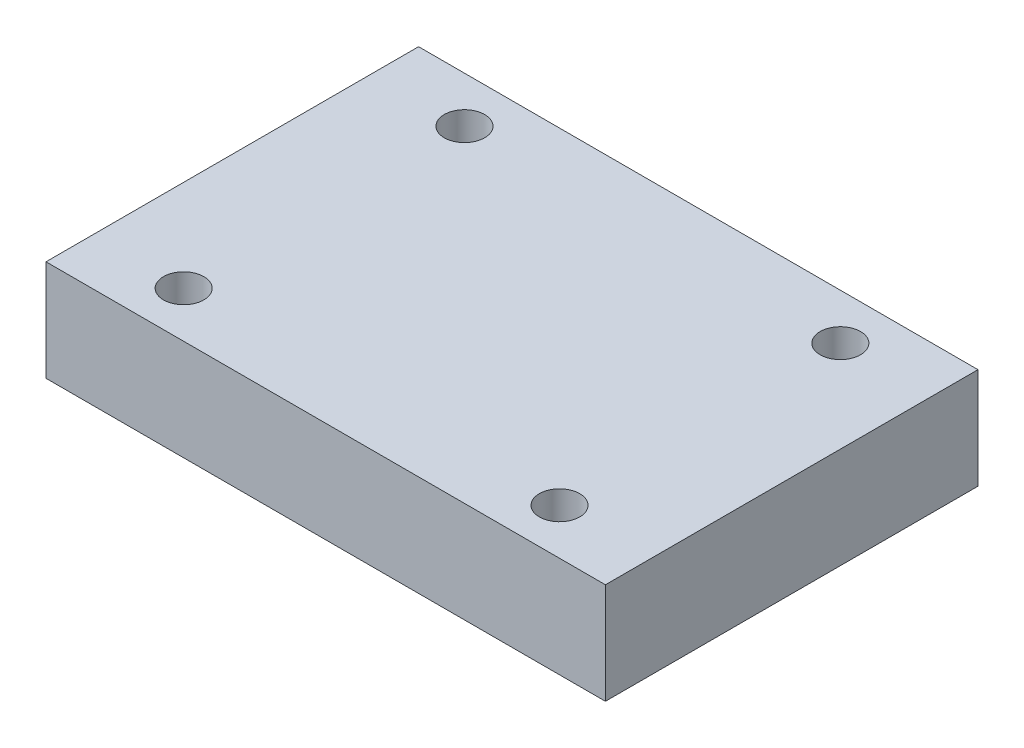
ISO-10303-21;
HEADER;
FILE_DESCRIPTION(('STEP AP214'),'2;1');
FILE_NAME('part.step','',(''),(''),'','','');
FILE_SCHEMA(('AUTOMOTIVE_DESIGN { 1 0 10303 214 1 1 1 1 }'));
ENDSEC;
DATA;
#1=APPLICATION_CONTEXT('core data for automotive mechanical design processes');
#2=APPLICATION_PROTOCOL_DEFINITION('international standard','automotive_design',2000,#1);
#3=PRODUCT_CONTEXT('',#1,'mechanical');
#4=PRODUCT('Part','Part','',(#3));
#5=PRODUCT_RELATED_PRODUCT_CATEGORY('part','',(#4));
#6=PRODUCT_DEFINITION_FORMATION('','',#4);
#7=PRODUCT_DEFINITION_CONTEXT('part definition',#1,'design');
#8=PRODUCT_DEFINITION('design','',#6,#7);
#9=PRODUCT_DEFINITION_SHAPE('','',#8);
#10=(LENGTH_UNIT() NAMED_UNIT(*) SI_UNIT(.MILLI.,.METRE.));
#11=(NAMED_UNIT(*) PLANE_ANGLE_UNIT() SI_UNIT($,.RADIAN.));
#12=(NAMED_UNIT(*) SI_UNIT($,.STERADIAN.) SOLID_ANGLE_UNIT());
#13=UNCERTAINTY_MEASURE_WITH_UNIT(LENGTH_MEASURE(1.E-05),#10,'distance_accuracy_value','');
#14=(GEOMETRIC_REPRESENTATION_CONTEXT(3) GLOBAL_UNCERTAINTY_ASSIGNED_CONTEXT((#13)) GLOBAL_UNIT_ASSIGNED_CONTEXT((#10,
#11,#12)) REPRESENTATION_CONTEXT('',''));
#15=CARTESIAN_POINT('',(0.,0.,0.));
#16=DIRECTION('',(0.,0.,1.));
#17=DIRECTION('',(1.,0.,0.));
#18=AXIS2_PLACEMENT_3D('',#15,#16,#17);
#19=CARTESIAN_POINT('',(0.,5.5,0.));
#20=DIRECTION('',(0.,-1.,0.));
#21=DIRECTION('',(0.,0.,-1.));
#22=AXIS2_PLACEMENT_3D('',#19,#20,#21);
#23=PLANE('',#22);
#24=DIRECTION('',(0.,0.,1.));
#25=VECTOR('',#24,1.);
#26=CARTESIAN_POINT('',(0.,5.5,0.));
#27=LINE('',#26,#25);
#28=CARTESIAN_POINT('',(0.,5.5,-20.3));
#29=VERTEX_POINT('',#28);
#30=CARTESIAN_POINT('',(0.,5.5,0.));
#31=VERTEX_POINT('',#30);
#32=EDGE_CURVE('E84',#29,#31,#27,.T.);
#33=ORIENTED_EDGE('',*,*,#32,.T.);
#34=DIRECTION('',(1.,0.,0.));
#35=VECTOR('',#34,1.);
#36=CARTESIAN_POINT('',(0.,5.5,0.));
#37=LINE('',#36,#35);
#38=CARTESIAN_POINT('',(30.48,5.5,0.));
#39=VERTEX_POINT('',#38);
#40=EDGE_CURVE('E79',#31,#39,#37,.T.);
#41=ORIENTED_EDGE('',*,*,#40,.T.);
#42=DIRECTION('',(0.,0.,-1.));
#43=VECTOR('',#42,1.);
#44=CARTESIAN_POINT('',(30.48,5.5,0.));
#45=LINE('',#44,#43);
#46=CARTESIAN_POINT('',(30.48,5.5,-20.3));
#47=VERTEX_POINT('',#46);
#48=EDGE_CURVE('E82',#39,#47,#45,.T.);
#49=ORIENTED_EDGE('',*,*,#48,.T.);
#50=DIRECTION('',(-1.,0.,0.));
#51=VECTOR('',#50,1.);
#52=CARTESIAN_POINT('',(0.,5.5,-20.3));
#53=LINE('',#52,#51);
#54=EDGE_CURVE('E49',#47,#29,#53,.T.);
#55=ORIENTED_EDGE('',*,*,#54,.T.);
#56=EDGE_LOOP('',(#33,#41,#49,#55));
#57=FACE_BOUND('',#56,.T.);
#58=CARTESIAN_POINT('',(5.,5.5,-17.8));
#59=DIRECTION('',(0.,1.,0.));
#60=DIRECTION('',(0.,0.,1.));
#61=AXIS2_PLACEMENT_3D('',#58,#59,#60);
#62=CIRCLE('',#61,1.1);
#63=CARTESIAN_POINT('',(5.,5.5,-16.7));
#64=VERTEX_POINT('',#63);
#65=EDGE_CURVE('E99',#64,#64,#62,.T.);
#66=ORIENTED_EDGE('',*,*,#65,.F.);
#67=EDGE_LOOP('',(#66));
#68=FACE_BOUND('',#67,.T.);
#69=CARTESIAN_POINT('',(25.48,5.5,-17.8));
#70=DIRECTION('',(0.,1.,0.));
#71=DIRECTION('',(0.,0.,1.));
#72=AXIS2_PLACEMENT_3D('',#69,#70,#71);
#73=CIRCLE('',#72,1.1);
#74=CARTESIAN_POINT('',(25.48,5.5,-16.7));
#75=VERTEX_POINT('',#74);
#76=EDGE_CURVE('E114',#75,#75,#73,.T.);
#77=ORIENTED_EDGE('',*,*,#76,.F.);
#78=EDGE_LOOP('',(#77));
#79=FACE_BOUND('',#78,.T.);
#80=CARTESIAN_POINT('',(25.48,5.5,-2.5));
#81=DIRECTION('',(0.,1.,0.));
#82=DIRECTION('',(0.,0.,1.));
#83=AXIS2_PLACEMENT_3D('',#80,#81,#82);
#84=CIRCLE('',#83,1.1);
#85=CARTESIAN_POINT('',(25.48,5.5,-1.4));
#86=VERTEX_POINT('',#85);
#87=EDGE_CURVE('E120',#86,#86,#84,.T.);
#88=ORIENTED_EDGE('',*,*,#87,.F.);
#89=EDGE_LOOP('',(#88));
#90=FACE_BOUND('',#89,.T.);
#91=CARTESIAN_POINT('',(5.,5.5,-2.5));
#92=DIRECTION('',(0.,1.,0.));
#93=DIRECTION('',(0.,0.,1.));
#94=AXIS2_PLACEMENT_3D('',#91,#92,#93);
#95=CIRCLE('',#94,1.1);
#96=CARTESIAN_POINT('',(5.,5.5,-1.4));
#97=VERTEX_POINT('',#96);
#98=EDGE_CURVE('E126',#97,#97,#95,.T.);
#99=ORIENTED_EDGE('',*,*,#98,.F.);
#100=EDGE_LOOP('',(#99));
#101=FACE_BOUND('',#100,.T.);
#102=ADVANCED_FACE('F32',(#57,#68,#79,#90,#101),#23,.F.);
#103=CARTESIAN_POINT('',(0.,0.,0.));
#104=DIRECTION('',(0.,-1.,0.));
#105=DIRECTION('',(0.,0.,-1.));
#106=AXIS2_PLACEMENT_3D('',#103,#104,#105);
#107=PLANE('',#106);
#108=CARTESIAN_POINT('',(25.48,0.,-2.5));
#109=DIRECTION('',(0.,1.,0.));
#110=DIRECTION('',(0.,0.,1.));
#111=AXIS2_PLACEMENT_3D('',#108,#109,#110);
#112=CIRCLE('',#111,1.1);
#113=CARTESIAN_POINT('',(25.48,0.,-1.4));
#114=VERTEX_POINT('',#113);
#115=EDGE_CURVE('E123',#114,#114,#112,.T.);
#116=ORIENTED_EDGE('',*,*,#115,.T.);
#117=EDGE_LOOP('',(#116));
#118=FACE_BOUND('',#117,.T.);
#119=CARTESIAN_POINT('',(5.,0.,-17.8));
#120=DIRECTION('',(0.,1.,0.));
#121=DIRECTION('',(0.,0.,1.));
#122=AXIS2_PLACEMENT_3D('',#119,#120,#121);
#123=CIRCLE('',#122,1.1);
#124=CARTESIAN_POINT('',(5.,0.,-16.7));
#125=VERTEX_POINT('',#124);
#126=EDGE_CURVE('E111',#125,#125,#123,.T.);
#127=ORIENTED_EDGE('',*,*,#126,.T.);
#128=EDGE_LOOP('',(#127));
#129=FACE_BOUND('',#128,.T.);
#130=DIRECTION('',(0.,0.,1.));
#131=VECTOR('',#130,1.);
#132=CARTESIAN_POINT('',(0.,0.,0.));
#133=LINE('',#132,#131);
#134=CARTESIAN_POINT('',(0.,0.,-20.3));
#135=VERTEX_POINT('',#134);
#136=CARTESIAN_POINT('',(0.,0.,0.));
#137=VERTEX_POINT('',#136);
#138=EDGE_CURVE('E96',#135,#137,#133,.T.);
#139=ORIENTED_EDGE('',*,*,#138,.F.);
#140=DIRECTION('',(-1.,0.,0.));
#141=VECTOR('',#140,1.);
#142=CARTESIAN_POINT('',(0.,0.,-20.3));
#143=LINE('',#142,#141);
#144=CARTESIAN_POINT('',(30.48,0.,-20.3));
#145=VERTEX_POINT('',#144);
#146=EDGE_CURVE('E72',#145,#135,#143,.T.);
#147=ORIENTED_EDGE('',*,*,#146,.F.);
#148=DIRECTION('',(0.,0.,-1.));
#149=VECTOR('',#148,1.);
#150=CARTESIAN_POINT('',(30.48,0.,0.));
#151=LINE('',#150,#149);
#152=CARTESIAN_POINT('',(30.48,0.,0.));
#153=VERTEX_POINT('',#152);
#154=EDGE_CURVE('E66',#153,#145,#151,.T.);
#155=ORIENTED_EDGE('',*,*,#154,.F.);
#156=DIRECTION('',(1.,0.,0.));
#157=VECTOR('',#156,1.);
#158=CARTESIAN_POINT('',(0.,0.,0.));
#159=LINE('',#158,#157);
#160=EDGE_CURVE('E88',#137,#153,#159,.T.);
#161=ORIENTED_EDGE('',*,*,#160,.F.);
#162=EDGE_LOOP('',(#139,#147,#155,#161));
#163=FACE_BOUND('',#162,.T.);
#164=CARTESIAN_POINT('',(25.48,0.,-17.8));
#165=DIRECTION('',(0.,1.,0.));
#166=DIRECTION('',(0.,0.,1.));
#167=AXIS2_PLACEMENT_3D('',#164,#165,#166);
#168=CIRCLE('',#167,1.1);
#169=CARTESIAN_POINT('',(25.48,0.,-16.7));
#170=VERTEX_POINT('',#169);
#171=EDGE_CURVE('E117',#170,#170,#168,.T.);
#172=ORIENTED_EDGE('',*,*,#171,.T.);
#173=EDGE_LOOP('',(#172));
#174=FACE_BOUND('',#173,.T.);
#175=CARTESIAN_POINT('',(5.,0.,-2.5));
#176=DIRECTION('',(0.,1.,0.));
#177=DIRECTION('',(0.,0.,1.));
#178=AXIS2_PLACEMENT_3D('',#175,#176,#177);
#179=CIRCLE('',#178,1.1);
#180=CARTESIAN_POINT('',(5.,0.,-1.4));
#181=VERTEX_POINT('',#180);
#182=EDGE_CURVE('E129',#181,#181,#179,.T.);
#183=ORIENTED_EDGE('',*,*,#182,.T.);
#184=EDGE_LOOP('',(#183));
#185=FACE_BOUND('',#184,.T.);
#186=ADVANCED_FACE('F107',(#118,#129,#163,#174,#185),#107,.T.);
#187=CARTESIAN_POINT('',(0.,5.5,0.));
#188=DIRECTION('',(1.,0.,0.));
#189=DIRECTION('',(0.,0.,-1.));
#190=AXIS2_PLACEMENT_3D('',#187,#188,#189);
#191=PLANE('',#190);
#192=ORIENTED_EDGE('',*,*,#138,.T.);
#193=DIRECTION('',(0.,-1.,0.));
#194=VECTOR('',#193,1.);
#195=CARTESIAN_POINT('',(0.,5.5,0.));
#196=LINE('',#195,#194);
#197=EDGE_CURVE('E11',#31,#137,#196,.T.);
#198=ORIENTED_EDGE('',*,*,#197,.F.);
#199=ORIENTED_EDGE('',*,*,#32,.F.);
#200=DIRECTION('',(0.,-1.,0.));
#201=VECTOR('',#200,1.);
#202=CARTESIAN_POINT('',(0.,5.5,-20.3));
#203=LINE('',#202,#201);
#204=EDGE_CURVE('E92',#29,#135,#203,.T.);
#205=ORIENTED_EDGE('',*,*,#204,.T.);
#206=EDGE_LOOP('',(#192,#198,#199,#205));
#207=FACE_BOUND('',#206,.T.);
#208=ADVANCED_FACE('F34',(#207),#191,.F.);
#209=CARTESIAN_POINT('',(0.,5.5,0.));
#210=DIRECTION('',(0.,0.,-1.));
#211=DIRECTION('',(-1.,0.,0.));
#212=AXIS2_PLACEMENT_3D('',#209,#210,#211);
#213=PLANE('',#212);
#214=ORIENTED_EDGE('',*,*,#160,.T.);
#215=DIRECTION('',(0.,-1.,0.));
#216=VECTOR('',#215,1.);
#217=CARTESIAN_POINT('',(30.48,5.5,0.));
#218=LINE('',#217,#216);
#219=EDGE_CURVE('E41',#39,#153,#218,.T.);
#220=ORIENTED_EDGE('',*,*,#219,.F.);
#221=ORIENTED_EDGE('',*,*,#40,.F.);
#222=ORIENTED_EDGE('',*,*,#197,.T.);
#223=EDGE_LOOP('',(#214,#220,#221,#222));
#224=FACE_BOUND('',#223,.T.);
#225=ADVANCED_FACE('F87',(#224),#213,.F.);
#226=CARTESIAN_POINT('',(30.48,5.5,0.));
#227=DIRECTION('',(-1.,0.,0.));
#228=DIRECTION('',(0.,0.,1.));
#229=AXIS2_PLACEMENT_3D('',#226,#227,#228);
#230=PLANE('',#229);
#231=ORIENTED_EDGE('',*,*,#154,.T.);
#232=DIRECTION('',(0.,-1.,0.));
#233=VECTOR('',#232,1.);
#234=CARTESIAN_POINT('',(30.48,5.5,-20.3));
#235=LINE('',#234,#233);
#236=EDGE_CURVE('E89',#47,#145,#235,.T.);
#237=ORIENTED_EDGE('',*,*,#236,.F.);
#238=ORIENTED_EDGE('',*,*,#48,.F.);
#239=ORIENTED_EDGE('',*,*,#219,.T.);
#240=EDGE_LOOP('',(#231,#237,#238,#239));
#241=FACE_BOUND('',#240,.T.);
#242=ADVANCED_FACE('F90',(#241),#230,.F.);
#243=CARTESIAN_POINT('',(0.,5.5,-20.3));
#244=DIRECTION('',(0.,0.,1.));
#245=DIRECTION('',(1.,0.,0.));
#246=AXIS2_PLACEMENT_3D('',#243,#244,#245);
#247=PLANE('',#246);
#248=ORIENTED_EDGE('',*,*,#146,.T.);
#249=ORIENTED_EDGE('',*,*,#204,.F.);
#250=ORIENTED_EDGE('',*,*,#54,.F.);
#251=ORIENTED_EDGE('',*,*,#236,.T.);
#252=EDGE_LOOP('',(#248,#249,#250,#251));
#253=FACE_BOUND('',#252,.T.);
#254=ADVANCED_FACE('F104',(#253),#247,.F.);
#255=CARTESIAN_POINT('',(5.,5.5,-17.8));
#256=DIRECTION('',(0.,-1.,0.));
#257=DIRECTION('',(0.,0.,-1.));
#258=AXIS2_PLACEMENT_3D('',#255,#256,#257);
#259=CYLINDRICAL_SURFACE('',#258,1.1);
#260=ORIENTED_EDGE('',*,*,#65,.T.);
#261=EDGE_LOOP('',(#260));
#262=FACE_BOUND('',#261,.T.);
#263=ORIENTED_EDGE('',*,*,#126,.F.);
#264=EDGE_LOOP('',(#263));
#265=FACE_BOUND('',#264,.T.);
#266=ADVANCED_FACE('F146',(#262,#265),#259,.F.);
#267=CARTESIAN_POINT('',(25.48,5.5,-17.8));
#268=DIRECTION('',(0.,-1.,0.));
#269=DIRECTION('',(0.,0.,-1.));
#270=AXIS2_PLACEMENT_3D('',#267,#268,#269);
#271=CYLINDRICAL_SURFACE('',#270,1.1);
#272=ORIENTED_EDGE('',*,*,#76,.T.);
#273=EDGE_LOOP('',(#272));
#274=FACE_BOUND('',#273,.T.);
#275=ORIENTED_EDGE('',*,*,#171,.F.);
#276=EDGE_LOOP('',(#275));
#277=FACE_BOUND('',#276,.T.);
#278=ADVANCED_FACE('F192',(#274,#277),#271,.F.);
#279=CARTESIAN_POINT('',(25.48,5.5,-2.5));
#280=DIRECTION('',(0.,-1.,0.));
#281=DIRECTION('',(0.,0.,-1.));
#282=AXIS2_PLACEMENT_3D('',#279,#280,#281);
#283=CYLINDRICAL_SURFACE('',#282,1.1);
#284=ORIENTED_EDGE('',*,*,#87,.T.);
#285=EDGE_LOOP('',(#284));
#286=FACE_BOUND('',#285,.T.);
#287=ORIENTED_EDGE('',*,*,#115,.F.);
#288=EDGE_LOOP('',(#287));
#289=FACE_BOUND('',#288,.T.);
#290=ADVANCED_FACE('F200',(#286,#289),#283,.F.);
#291=CARTESIAN_POINT('',(5.,5.5,-2.5));
#292=DIRECTION('',(0.,-1.,0.));
#293=DIRECTION('',(0.,0.,-1.));
#294=AXIS2_PLACEMENT_3D('',#291,#292,#293);
#295=CYLINDRICAL_SURFACE('',#294,1.1);
#296=ORIENTED_EDGE('',*,*,#98,.T.);
#297=EDGE_LOOP('',(#296));
#298=FACE_BOUND('',#297,.T.);
#299=ORIENTED_EDGE('',*,*,#182,.F.);
#300=EDGE_LOOP('',(#299));
#301=FACE_BOUND('',#300,.T.);
#302=ADVANCED_FACE('F135',(#298,#301),#295,.F.);
#303=CLOSED_SHELL('',(#102,#186,#208,#225,#242,#254,#266,#278,#290,#302));
#304=MANIFOLD_SOLID_BREP('B2',#303);
#305=ADVANCED_BREP_SHAPE_REPRESENTATION('',(#18,#304),#14);
#306=SHAPE_DEFINITION_REPRESENTATION(#9,#305);
ENDSEC;
END-ISO-10303-21;
